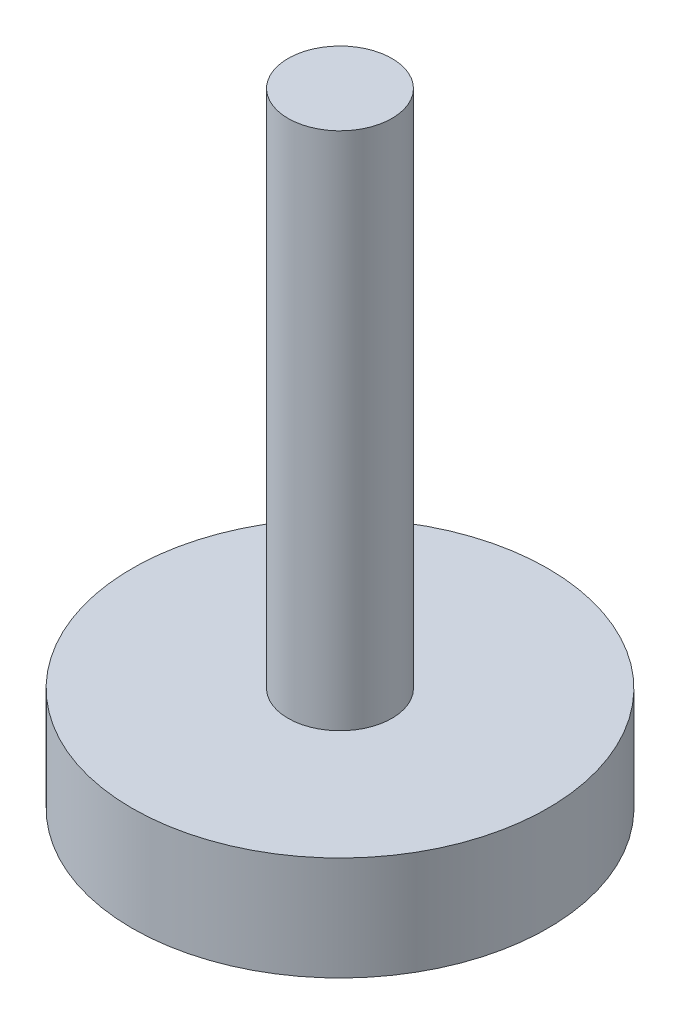
ISO-10303-21;
HEADER;
FILE_DESCRIPTION(('STEP AP214'),'2;1');
FILE_NAME('part.step','',(''),(''),'','','');
FILE_SCHEMA(('AUTOMOTIVE_DESIGN { 1 0 10303 214 1 1 1 1 }'));
ENDSEC;
DATA;
#1=APPLICATION_CONTEXT('core data for automotive mechanical design processes');
#2=APPLICATION_PROTOCOL_DEFINITION('international standard','automotive_design',2000,#1);
#3=PRODUCT_CONTEXT('',#1,'mechanical');
#4=PRODUCT('Part','Part','',(#3));
#5=PRODUCT_RELATED_PRODUCT_CATEGORY('part','',(#4));
#6=PRODUCT_DEFINITION_FORMATION('','',#4);
#7=PRODUCT_DEFINITION_CONTEXT('part definition',#1,'design');
#8=PRODUCT_DEFINITION('design','',#6,#7);
#9=PRODUCT_DEFINITION_SHAPE('','',#8);
#10=(LENGTH_UNIT() NAMED_UNIT(*) SI_UNIT(.MILLI.,.METRE.));
#11=(NAMED_UNIT(*) PLANE_ANGLE_UNIT() SI_UNIT($,.RADIAN.));
#12=(NAMED_UNIT(*) SI_UNIT($,.STERADIAN.) SOLID_ANGLE_UNIT());
#13=UNCERTAINTY_MEASURE_WITH_UNIT(LENGTH_MEASURE(1.E-05),#10,'distance_accuracy_value','');
#14=(GEOMETRIC_REPRESENTATION_CONTEXT(3) GLOBAL_UNCERTAINTY_ASSIGNED_CONTEXT((#13)) GLOBAL_UNIT_ASSIGNED_CONTEXT((#10,
#11,#12)) REPRESENTATION_CONTEXT('',''));
#15=CARTESIAN_POINT('',(0.,0.,0.));
#16=DIRECTION('',(0.,0.,1.));
#17=DIRECTION('',(1.,0.,0.));
#18=AXIS2_PLACEMENT_3D('',#15,#16,#17);
#19=CARTESIAN_POINT('',(0.,10.,0.));
#20=DIRECTION('',(0.,-1.,0.));
#21=DIRECTION('',(0.,0.,-1.));
#22=AXIS2_PLACEMENT_3D('',#19,#20,#21);
#23=CYLINDRICAL_SURFACE('',#22,20.);
#24=CARTESIAN_POINT('',(0.,10.,0.));
#25=DIRECTION('',(0.,1.,0.));
#26=DIRECTION('',(0.,0.,1.));
#27=AXIS2_PLACEMENT_3D('',#24,#25,#26);
#28=CIRCLE('',#27,20.);
#29=CARTESIAN_POINT('',(0.,10.,20.));
#30=VERTEX_POINT('',#29);
#31=EDGE_CURVE('E43',#30,#30,#28,.T.);
#32=ORIENTED_EDGE('',*,*,#31,.F.);
#33=EDGE_LOOP('',(#32));
#34=FACE_BOUND('',#33,.T.);
#35=CARTESIAN_POINT('',(0.,0.,0.));
#36=DIRECTION('',(0.,1.,0.));
#37=DIRECTION('',(0.,0.,1.));
#38=AXIS2_PLACEMENT_3D('',#35,#36,#37);
#39=CIRCLE('',#38,20.);
#40=CARTESIAN_POINT('',(0.,0.,20.));
#41=VERTEX_POINT('',#40);
#42=EDGE_CURVE('E39',#41,#41,#39,.T.);
#43=ORIENTED_EDGE('',*,*,#42,.T.);
#44=EDGE_LOOP('',(#43));
#45=FACE_BOUND('',#44,.T.);
#46=ADVANCED_FACE('F36',(#34,#45),#23,.T.);
#47=CARTESIAN_POINT('',(0.,10.,0.));
#48=DIRECTION('',(0.,1.,0.));
#49=DIRECTION('',(0.,0.,1.));
#50=AXIS2_PLACEMENT_3D('',#47,#48,#49);
#51=PLANE('',#50);
#52=CARTESIAN_POINT('',(0.,10.,0.));
#53=DIRECTION('',(0.,1.,0.));
#54=DIRECTION('',(0.,0.,1.));
#55=AXIS2_PLACEMENT_3D('',#52,#53,#54);
#56=CIRCLE('',#55,5.);
#57=CARTESIAN_POINT('',(0.,10.,5.));
#58=VERTEX_POINT('',#57);
#59=EDGE_CURVE('E10',#58,#58,#56,.T.);
#60=ORIENTED_EDGE('',*,*,#59,.F.);
#61=EDGE_LOOP('',(#60));
#62=FACE_BOUND('',#61,.T.);
#63=ORIENTED_EDGE('',*,*,#31,.T.);
#64=EDGE_LOOP('',(#63));
#65=FACE_BOUND('',#64,.T.);
#66=ADVANCED_FACE('F60',(#62,#65),#51,.T.);
#67=CARTESIAN_POINT('',(0.,0.,0.));
#68=DIRECTION('',(0.,1.,0.));
#69=DIRECTION('',(0.,0.,1.));
#70=AXIS2_PLACEMENT_3D('',#67,#68,#69);
#71=PLANE('',#70);
#72=ORIENTED_EDGE('',*,*,#42,.F.);
#73=EDGE_LOOP('',(#72));
#74=FACE_BOUND('',#73,.T.);
#75=ADVANCED_FACE('F57',(#74),#71,.F.);
#76=CARTESIAN_POINT('',(0.,60.,0.));
#77=DIRECTION('',(0.,-1.,0.));
#78=DIRECTION('',(0.,0.,-1.));
#79=AXIS2_PLACEMENT_3D('',#76,#77,#78);
#80=CYLINDRICAL_SURFACE('',#79,5.);
#81=CARTESIAN_POINT('',(0.,60.,0.));
#82=DIRECTION('',(0.,1.,0.));
#83=DIRECTION('',(0.,0.,1.));
#84=AXIS2_PLACEMENT_3D('',#81,#82,#83);
#85=CIRCLE('',#84,5.);
#86=CARTESIAN_POINT('',(0.,60.,5.));
#87=VERTEX_POINT('',#86);
#88=EDGE_CURVE('E49',#87,#87,#85,.T.);
#89=ORIENTED_EDGE('',*,*,#88,.F.);
#90=EDGE_LOOP('',(#89));
#91=FACE_BOUND('',#90,.T.);
#92=ORIENTED_EDGE('',*,*,#59,.T.);
#93=EDGE_LOOP('',(#92));
#94=FACE_BOUND('',#93,.T.);
#95=ADVANCED_FACE('F59',(#91,#94),#80,.T.);
#96=CARTESIAN_POINT('',(0.,60.,0.));
#97=DIRECTION('',(0.,1.,0.));
#98=DIRECTION('',(0.,0.,1.));
#99=AXIS2_PLACEMENT_3D('',#96,#97,#98);
#100=PLANE('',#99);
#101=ORIENTED_EDGE('',*,*,#88,.T.);
#102=EDGE_LOOP('',(#101));
#103=FACE_BOUND('',#102,.T.);
#104=ADVANCED_FACE('F65',(#103),#100,.T.);
#105=CLOSED_SHELL('',(#46,#66,#75,#95,#104));
#106=MANIFOLD_SOLID_BREP('B2',#105);
#107=ADVANCED_BREP_SHAPE_REPRESENTATION('',(#18,#106),#14);
#108=SHAPE_DEFINITION_REPRESENTATION(#9,#107);
ENDSEC;
END-ISO-10303-21;
